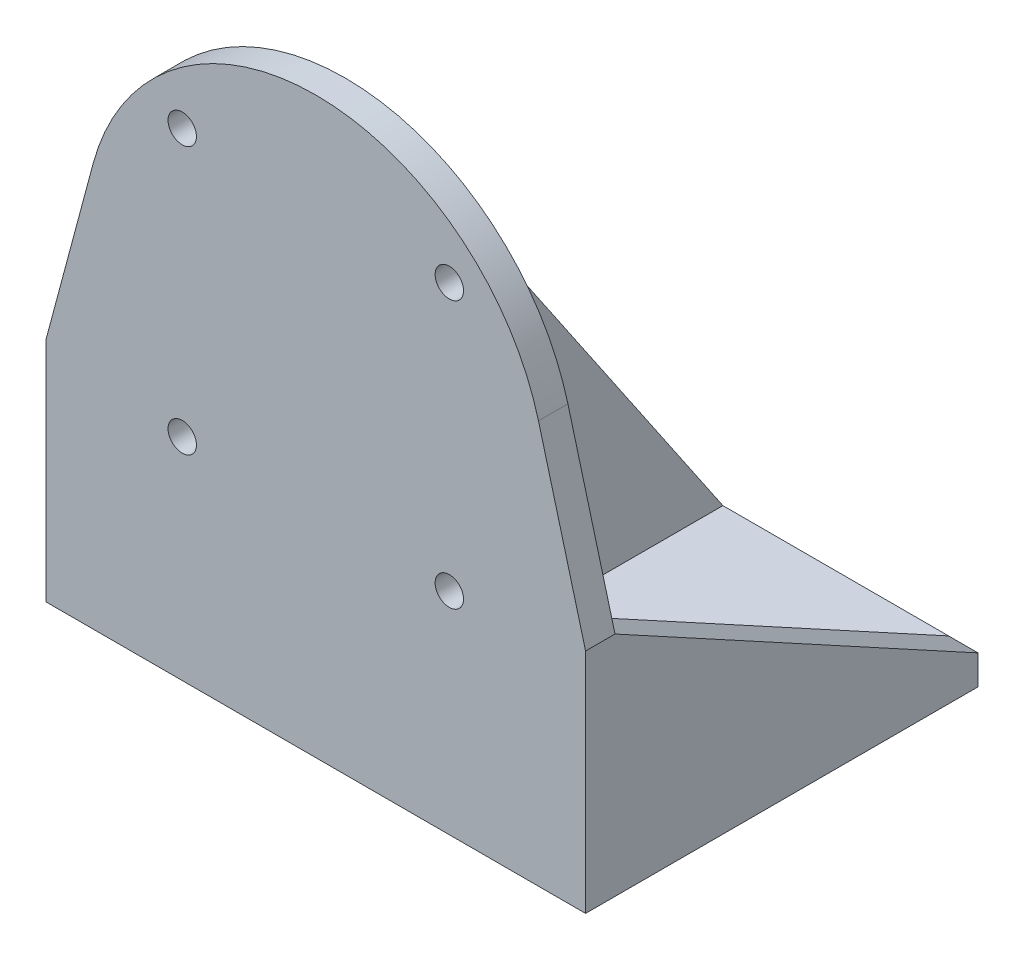
ISO-10303-21;
HEADER;
FILE_DESCRIPTION(('STEP AP214'),'2;1');
FILE_NAME('part.step','',(''),(''),'','','');
FILE_SCHEMA(('AUTOMOTIVE_DESIGN { 1 0 10303 214 1 1 1 1 }'));
ENDSEC;
DATA;
#1=APPLICATION_CONTEXT('core data for automotive mechanical design processes');
#2=APPLICATION_PROTOCOL_DEFINITION('international standard','automotive_design',2000,#1);
#3=PRODUCT_CONTEXT('',#1,'mechanical');
#4=PRODUCT('Part','Part','',(#3));
#5=PRODUCT_RELATED_PRODUCT_CATEGORY('part','',(#4));
#6=PRODUCT_DEFINITION_FORMATION('','',#4);
#7=PRODUCT_DEFINITION_CONTEXT('part definition',#1,'design');
#8=PRODUCT_DEFINITION('design','',#6,#7);
#9=PRODUCT_DEFINITION_SHAPE('','',#8);
#10=(LENGTH_UNIT() NAMED_UNIT(*) SI_UNIT(.MILLI.,.METRE.));
#11=(NAMED_UNIT(*) PLANE_ANGLE_UNIT() SI_UNIT($,.RADIAN.));
#12=(NAMED_UNIT(*) SI_UNIT($,.STERADIAN.) SOLID_ANGLE_UNIT());
#13=UNCERTAINTY_MEASURE_WITH_UNIT(LENGTH_MEASURE(1.E-05),#10,'distance_accuracy_value','');
#14=(GEOMETRIC_REPRESENTATION_CONTEXT(3) GLOBAL_UNCERTAINTY_ASSIGNED_CONTEXT((#13)) GLOBAL_UNIT_ASSIGNED_CONTEXT((#10,
#11,#12)) REPRESENTATION_CONTEXT('',''));
#15=CARTESIAN_POINT('',(0.,0.,0.));
#16=DIRECTION('',(0.,0.,1.));
#17=DIRECTION('',(1.,0.,0.));
#18=AXIS2_PLACEMENT_3D('',#15,#16,#17);
#19=CARTESIAN_POINT('',(13.612,-13.7439864135799,-3.));
#20=DIRECTION('',(0.,0.,-1.));
#21=DIRECTION('',(-1.,0.,0.));
#22=AXIS2_PLACEMENT_3D('',#19,#20,#21);
#23=PLANE('',#22);
#24=CARTESIAN_POINT('',(27.224,-27.224,-3.));
#25=DIRECTION('',(0.,0.,1.));
#26=DIRECTION('',(1.,0.,0.));
#27=AXIS2_PLACEMENT_3D('',#24,#25,#26);
#28=CIRCLE('',#27,1.447765);
#29=CARTESIAN_POINT('',(28.671765,-27.224,-3.));
#30=VERTEX_POINT('',#29);
#31=EDGE_CURVE('E216',#30,#30,#28,.T.);
#32=ORIENTED_EDGE('',*,*,#31,.T.);
#33=EDGE_LOOP('',(#32));
#34=FACE_BOUND('',#33,.T.);
#35=CARTESIAN_POINT('',(0.,-27.224,-3.));
#36=DIRECTION('',(0.,0.,1.));
#37=DIRECTION('',(1.,0.,0.));
#38=AXIS2_PLACEMENT_3D('',#35,#36,#37);
#39=CIRCLE('',#38,1.447765);
#40=CARTESIAN_POINT('',(1.447765,-27.224,-3.));
#41=VERTEX_POINT('',#40);
#42=EDGE_CURVE('E223',#41,#41,#39,.T.);
#43=ORIENTED_EDGE('',*,*,#42,.T.);
#44=EDGE_LOOP('',(#43));
#45=FACE_BOUND('',#44,.T.);
#46=CARTESIAN_POINT('',(27.224,0.,-3.));
#47=DIRECTION('',(0.,0.,1.));
#48=DIRECTION('',(1.,0.,0.));
#49=AXIS2_PLACEMENT_3D('',#46,#47,#48);
#50=CIRCLE('',#49,1.447765);
#51=CARTESIAN_POINT('',(28.671765,0.,-3.));
#52=VERTEX_POINT('',#51);
#53=EDGE_CURVE('E229',#52,#52,#50,.T.);
#54=ORIENTED_EDGE('',*,*,#53,.T.);
#55=EDGE_LOOP('',(#54));
#56=FACE_BOUND('',#55,.T.);
#57=CARTESIAN_POINT('',(0.,0.,-3.));
#58=DIRECTION('',(0.,0.,1.));
#59=DIRECTION('',(1.,0.,0.));
#60=AXIS2_PLACEMENT_3D('',#57,#58,#59);
#61=CIRCLE('',#60,1.447765);
#62=CARTESIAN_POINT('',(1.447765,0.,-3.));
#63=VERTEX_POINT('',#62);
#64=EDGE_CURVE('E235',#63,#63,#61,.T.);
#65=ORIENTED_EDGE('',*,*,#64,.T.);
#66=EDGE_LOOP('',(#65));
#67=FACE_BOUND('',#66,.T.);
#68=DIRECTION('',(0.,-1.,0.));
#69=VECTOR('',#68,1.);
#70=CARTESIAN_POINT('',(-10.8879982105435,-25.5783456611067,-3.));
#71=LINE('',#70,#69);
#72=CARTESIAN_POINT('',(-10.8879982105435,-25.5783456611067,-3.));
#73=VERTEX_POINT('',#72);
#74=CARTESIAN_POINT('',(-10.8879982105435,-45.7439892722092,-3.));
#75=VERTEX_POINT('',#74);
#76=EDGE_CURVE('E184',#73,#75,#71,.T.);
#77=ORIENTED_EDGE('',*,*,#76,.F.);
#78=DIRECTION('',(-1.,0.,0.));
#79=VECTOR('',#78,1.);
#80=CARTESIAN_POINT('',(-10.8879982105435,-25.5783456611067,-3.));
#81=LINE('',#80,#79);
#82=CARTESIAN_POINT('',(-13.8879982105435,-25.5783456611067,-3.));
#83=VERTEX_POINT('',#82);
#84=EDGE_CURVE('E290',#73,#83,#81,.T.);
#85=ORIENTED_EDGE('',*,*,#84,.T.);
#86=DIRECTION('',(-0.258819045102518,-0.965925826289069,0.));
#87=VECTOR('',#86,1.);
#88=CARTESIAN_POINT('',(-9.08725691779313,-7.66173885367076,-3.));
#89=LINE('',#88,#87);
#90=CARTESIAN_POINT('',(-9.08725691779313,-7.66173885367076,-3.));
#91=VERTEX_POINT('',#90);
#92=EDGE_CURVE('E244',#91,#83,#89,.T.);
#93=ORIENTED_EDGE('',*,*,#92,.F.);
#94=CARTESIAN_POINT('',(13.612,-13.7439864135799,-3.));
#95=DIRECTION('',(0.,0.,1.));
#96=DIRECTION('',(-1.,0.,0.));
#97=AXIS2_PLACEMENT_3D('',#94,#95,#96);
#98=CIRCLE('',#97,23.5);
#99=CARTESIAN_POINT('',(36.3112569177931,-7.66173885367076,-3.));
#100=VERTEX_POINT('',#99);
#101=EDGE_CURVE('E241',#100,#91,#98,.T.);
#102=ORIENTED_EDGE('',*,*,#101,.F.);
#103=DIRECTION('',(-0.258819045102518,0.965925826289069,0.));
#104=VECTOR('',#103,1.);
#105=CARTESIAN_POINT('',(36.3112569177931,-7.66173885367076,-3.));
#106=LINE('',#105,#104);
#107=CARTESIAN_POINT('',(41.1119982105435,-25.5783456611067,-3.));
#108=VERTEX_POINT('',#107);
#109=EDGE_CURVE('E248',#108,#100,#106,.T.);
#110=ORIENTED_EDGE('',*,*,#109,.F.);
#111=DIRECTION('',(1.,0.,0.));
#112=VECTOR('',#111,1.);
#113=CARTESIAN_POINT('',(38.1119982105435,-25.5783456611067,-3.));
#114=LINE('',#113,#112);
#115=CARTESIAN_POINT('',(38.1119982105435,-25.5783456611067,-3.));
#116=VERTEX_POINT('',#115);
#117=EDGE_CURVE('E323',#116,#108,#114,.T.);
#118=ORIENTED_EDGE('',*,*,#117,.F.);
#119=DIRECTION('',(0.,-1.,0.));
#120=VECTOR('',#119,1.);
#121=CARTESIAN_POINT('',(38.1119982105435,-25.5783456611067,-3.));
#122=LINE('',#121,#120);
#123=CARTESIAN_POINT('',(38.1119982105435,-45.7439892722092,-3.));
#124=VERTEX_POINT('',#123);
#125=EDGE_CURVE('E321',#116,#124,#122,.T.);
#126=ORIENTED_EDGE('',*,*,#125,.T.);
#127=DIRECTION('',(1.,0.,0.));
#128=VECTOR('',#127,1.);
#129=CARTESIAN_POINT('',(41.1119982105435,-45.7439892722092,-3.));
#130=LINE('',#129,#128);
#131=CARTESIAN_POINT('',(15.112,-45.7439892722092,-3.));
#132=VERTEX_POINT('',#131);
#133=EDGE_CURVE('E206',#132,#124,#130,.T.);
#134=ORIENTED_EDGE('',*,*,#133,.F.);
#135=DIRECTION('',(0.,1.,0.));
#136=VECTOR('',#135,1.);
#137=CARTESIAN_POINT('',(15.112,-45.7439892722092,-3.));
#138=LINE('',#137,#136);
#139=CARTESIAN_POINT('',(15.112,8.75601817311227,-3.));
#140=VERTEX_POINT('',#139);
#141=EDGE_CURVE('E409',#132,#140,#138,.T.);
#142=ORIENTED_EDGE('',*,*,#141,.T.);
#143=DIRECTION('',(-1.,0.,0.));
#144=VECTOR('',#143,1.);
#145=CARTESIAN_POINT('',(15.112,8.75601817311227,-3.));
#146=LINE('',#145,#144);
#147=CARTESIAN_POINT('',(12.112,8.75601817311227,-3.));
#148=VERTEX_POINT('',#147);
#149=EDGE_CURVE('E317',#140,#148,#146,.T.);
#150=ORIENTED_EDGE('',*,*,#149,.T.);
#151=DIRECTION('',(0.,1.,0.));
#152=VECTOR('',#151,1.);
#153=CARTESIAN_POINT('',(12.112,-45.7439892722092,-3.));
#154=LINE('',#153,#152);
#155=CARTESIAN_POINT('',(12.112,-45.7439892722092,-3.));
#156=VERTEX_POINT('',#155);
#157=EDGE_CURVE('E204',#156,#148,#154,.T.);
#158=ORIENTED_EDGE('',*,*,#157,.F.);
#159=EDGE_CURVE('E196',#75,#156,#130,.T.);
#160=ORIENTED_EDGE('',*,*,#159,.F.);
#161=EDGE_LOOP('',(#77,#85,#93,#102,#110,#118,#126,#134,#142,#150,#158,#160));
#162=FACE_BOUND('',#161,.T.);
#163=ADVANCED_FACE('F41',(#34,#45,#56,#67,#162),#23,.T.);
#164=CARTESIAN_POINT('',(41.1119982105435,-45.7439892722092,-40.));
#165=DIRECTION('',(0.,-1.,0.));
#166=DIRECTION('',(0.,0.,-1.));
#167=AXIS2_PLACEMENT_3D('',#164,#165,#166);
#168=PLANE('',#167);
#169=DIRECTION('',(0.,0.,1.));
#170=VECTOR('',#169,1.);
#171=CARTESIAN_POINT('',(29.1119982105435,-45.7439892722092,-30.));
#172=LINE('',#171,#170);
#173=CARTESIAN_POINT('',(29.1119982105435,-45.7439892722092,-30.));
#174=VERTEX_POINT('',#173);
#175=CARTESIAN_POINT('',(29.1119982105435,-45.7439892722092,-13.));
#176=VERTEX_POINT('',#175);
#177=EDGE_CURVE('E344',#174,#176,#172,.T.);
#178=ORIENTED_EDGE('',*,*,#177,.F.);
#179=CARTESIAN_POINT('',(30.7119982105435,-45.7439892722092,-30.));
#180=DIRECTION('',(0.,1.,0.));
#181=DIRECTION('',(0.,0.,1.));
#182=AXIS2_PLACEMENT_3D('',#179,#180,#181);
#183=CIRCLE('',#182,1.6);
#184=CARTESIAN_POINT('',(32.3119982105435,-45.7439892722092,-30.));
#185=VERTEX_POINT('',#184);
#186=EDGE_CURVE('E342',#185,#174,#183,.T.);
#187=ORIENTED_EDGE('',*,*,#186,.F.);
#188=DIRECTION('',(0.,0.,-1.));
#189=VECTOR('',#188,1.);
#190=CARTESIAN_POINT('',(32.3119982105435,-45.7439892722092,-13.));
#191=LINE('',#190,#189);
#192=CARTESIAN_POINT('',(32.3119982105435,-45.7439892722092,-13.));
#193=VERTEX_POINT('',#192);
#194=EDGE_CURVE('E332',#193,#185,#191,.T.);
#195=ORIENTED_EDGE('',*,*,#194,.F.);
#196=CARTESIAN_POINT('',(30.7119982105435,-45.7439892722092,-13.));
#197=DIRECTION('',(0.,1.,0.));
#198=DIRECTION('',(0.,0.,-1.));
#199=AXIS2_PLACEMENT_3D('',#196,#197,#198);
#200=CIRCLE('',#199,1.6);
#201=EDGE_CURVE('E348',#176,#193,#200,.T.);
#202=ORIENTED_EDGE('',*,*,#201,.F.);
#203=EDGE_LOOP('',(#178,#187,#195,#202));
#204=FACE_BOUND('',#203,.T.);
#205=DIRECTION('',(0.,0.,1.));
#206=VECTOR('',#205,1.);
#207=CARTESIAN_POINT('',(15.112,-45.7439892722092,-40.));
#208=LINE('',#207,#206);
#209=CARTESIAN_POINT('',(15.112,-45.7439892722092,-40.));
#210=VERTEX_POINT('',#209);
#211=EDGE_CURVE('E406',#210,#132,#208,.T.);
#212=ORIENTED_EDGE('',*,*,#211,.T.);
#213=ORIENTED_EDGE('',*,*,#133,.T.);
#214=DIRECTION('',(0.,0.,-1.));
#215=VECTOR('',#214,1.);
#216=CARTESIAN_POINT('',(38.1119982105435,-45.7439892722092,-3.));
#217=LINE('',#216,#215);
#218=CARTESIAN_POINT('',(38.1119982105435,-45.7439892722092,-40.));
#219=VERTEX_POINT('',#218);
#220=EDGE_CURVE('E311',#124,#219,#217,.T.);
#221=ORIENTED_EDGE('',*,*,#220,.T.);
#222=DIRECTION('',(1.,0.,0.));
#223=VECTOR('',#222,1.);
#224=CARTESIAN_POINT('',(41.1119982105435,-45.7439892722092,-40.));
#225=LINE('',#224,#223);
#226=EDGE_CURVE('E392',#210,#219,#225,.T.);
#227=ORIENTED_EDGE('',*,*,#226,.F.);
#228=EDGE_LOOP('',(#212,#213,#221,#227));
#229=FACE_BOUND('',#228,.T.);
#230=ADVANCED_FACE('F421',(#204,#229),#168,.F.);
#231=CARTESIAN_POINT('',(13.612,-13.7439864135799,-3.));
#232=DIRECTION('',(0.,0.,1.));
#233=DIRECTION('',(1.,0.,0.));
#234=AXIS2_PLACEMENT_3D('',#231,#232,#233);
#235=CYLINDRICAL_SURFACE('',#234,23.5);
#236=CARTESIAN_POINT('',(13.612,-13.7439864135799,0.));
#237=DIRECTION('',(0.,0.,1.));
#238=DIRECTION('',(-1.,0.,0.));
#239=AXIS2_PLACEMENT_3D('',#236,#237,#238);
#240=CIRCLE('',#239,23.5);
#241=CARTESIAN_POINT('',(36.3112569177931,-7.66173885367076,0.));
#242=VERTEX_POINT('',#241);
#243=CARTESIAN_POINT('',(-9.08725691779313,-7.66173885367076,0.));
#244=VERTEX_POINT('',#243);
#245=EDGE_CURVE('E238',#242,#244,#240,.T.);
#246=ORIENTED_EDGE('',*,*,#245,.F.);
#247=DIRECTION('',(0.,0.,1.));
#248=VECTOR('',#247,1.);
#249=CARTESIAN_POINT('',(36.3112569177931,-7.66173885367076,-3.));
#250=LINE('',#249,#248);
#251=EDGE_CURVE('E11',#100,#242,#250,.T.);
#252=ORIENTED_EDGE('',*,*,#251,.F.);
#253=ORIENTED_EDGE('',*,*,#101,.T.);
#254=DIRECTION('',(0.,0.,1.));
#255=VECTOR('',#254,1.);
#256=CARTESIAN_POINT('',(-9.08725691779313,-7.66173885367076,-3.));
#257=LINE('',#256,#255);
#258=EDGE_CURVE('E45',#91,#244,#257,.T.);
#259=ORIENTED_EDGE('',*,*,#258,.T.);
#260=EDGE_LOOP('',(#246,#252,#253,#259));
#261=FACE_BOUND('',#260,.T.);
#262=ADVANCED_FACE('F43',(#261),#235,.T.);
#263=CARTESIAN_POINT('',(36.3112569177931,-7.66173885367076,-3.));
#264=DIRECTION('',(0.965925826289069,0.258819045102518,0.));
#265=DIRECTION('',(-0.258819045102518,0.965925826289069,0.));
#266=AXIS2_PLACEMENT_3D('',#263,#264,#265);
#267=PLANE('',#266);
#268=DIRECTION('',(-0.258819045102518,0.965925826289069,0.));
#269=VECTOR('',#268,1.);
#270=CARTESIAN_POINT('',(36.3112569177931,-7.66173885367076,0.));
#271=LINE('',#270,#269);
#272=CARTESIAN_POINT('',(41.1119982105435,-25.5783492722092,0.));
#273=VERTEX_POINT('',#272);
#274=EDGE_CURVE('E245',#273,#242,#271,.T.);
#275=ORIENTED_EDGE('',*,*,#274,.F.);
#276=DIRECTION('',(0.,0.,1.));
#277=VECTOR('',#276,1.);
#278=CARTESIAN_POINT('',(41.1119982105435,-25.5783492722092,-3.));
#279=LINE('',#278,#277);
#280=EDGE_CURVE('E50',#108,#273,#279,.T.);
#281=ORIENTED_EDGE('',*,*,#280,.F.);
#282=ORIENTED_EDGE('',*,*,#109,.T.);
#283=ORIENTED_EDGE('',*,*,#251,.T.);
#284=EDGE_LOOP('',(#275,#281,#282,#283));
#285=FACE_BOUND('',#284,.T.);
#286=ADVANCED_FACE('F287',(#285),#267,.T.);
#287=CARTESIAN_POINT('',(41.1119982105435,-25.5783492722092,-3.));
#288=DIRECTION('',(1.,0.,0.));
#289=DIRECTION('',(0.,1.,0.));
#290=AXIS2_PLACEMENT_3D('',#287,#288,#289);
#291=PLANE('',#290);
#292=DIRECTION('',(0.,0.478556275403788,0.878056883847313));
#293=VECTOR('',#292,1.);
#294=CARTESIAN_POINT('',(41.1119982105435,-45.7439892722092,-40.));
#295=LINE('',#294,#293);
#296=CARTESIAN_POINT('',(41.1119982105435,-45.7439892722092,-40.));
#297=VERTEX_POINT('',#296);
#298=EDGE_CURVE('E307',#297,#108,#295,.T.);
#299=ORIENTED_EDGE('',*,*,#298,.T.);
#300=ORIENTED_EDGE('',*,*,#280,.T.);
#301=DIRECTION('',(0.,1.,0.));
#302=VECTOR('',#301,1.);
#303=CARTESIAN_POINT('',(41.1119982105435,-25.5783492722092,0.));
#304=LINE('',#303,#302);
#305=CARTESIAN_POINT('',(41.1119982105435,-48.7439892722092,0.));
#306=VERTEX_POINT('',#305);
#307=EDGE_CURVE('E262',#306,#273,#304,.T.);
#308=ORIENTED_EDGE('',*,*,#307,.F.);
#309=DIRECTION('',(0.,0.,1.));
#310=VECTOR('',#309,1.);
#311=CARTESIAN_POINT('',(41.1119982105435,-48.7439892722092,-3.));
#312=LINE('',#311,#310);
#313=CARTESIAN_POINT('',(41.1119982105435,-48.7439892722092,-40.));
#314=VERTEX_POINT('',#313);
#315=EDGE_CURVE('E268',#314,#306,#312,.T.);
#316=ORIENTED_EDGE('',*,*,#315,.F.);
#317=DIRECTION('',(0.,-1.,0.));
#318=VECTOR('',#317,1.);
#319=CARTESIAN_POINT('',(41.1119982105435,-45.7439892722092,-40.));
#320=LINE('',#319,#318);
#321=EDGE_CURVE('E205',#297,#314,#320,.T.);
#322=ORIENTED_EDGE('',*,*,#321,.F.);
#323=EDGE_LOOP('',(#299,#300,#308,#316,#322));
#324=FACE_BOUND('',#323,.T.);
#325=ADVANCED_FACE('F306',(#324),#291,.T.);
#326=CARTESIAN_POINT('',(-13.8879982105435,-48.7439892722092,-3.));
#327=DIRECTION('',(0.,-1.,0.));
#328=DIRECTION('',(0.,0.,-1.));
#329=AXIS2_PLACEMENT_3D('',#326,#327,#328);
#330=PLANE('',#329);
#331=CARTESIAN_POINT('',(30.7119982105435,-48.7439892722092,-30.));
#332=DIRECTION('',(0.,1.,0.));
#333=DIRECTION('',(0.,0.,1.));
#334=AXIS2_PLACEMENT_3D('',#331,#332,#333);
#335=CIRCLE('',#334,1.6);
#336=CARTESIAN_POINT('',(32.3119982105435,-48.7439892722092,-30.));
#337=VERTEX_POINT('',#336);
#338=CARTESIAN_POINT('',(29.1119982105435,-48.7439892722092,-30.));
#339=VERTEX_POINT('',#338);
#340=EDGE_CURVE('E328',#337,#339,#335,.T.);
#341=ORIENTED_EDGE('',*,*,#340,.T.);
#342=DIRECTION('',(0.,0.,1.));
#343=VECTOR('',#342,1.);
#344=CARTESIAN_POINT('',(29.1119982105435,-48.7439892722092,-30.));
#345=LINE('',#344,#343);
#346=CARTESIAN_POINT('',(29.1119982105435,-48.7439892722092,-13.));
#347=VERTEX_POINT('',#346);
#348=EDGE_CURVE('E331',#339,#347,#345,.T.);
#349=ORIENTED_EDGE('',*,*,#348,.T.);
#350=CARTESIAN_POINT('',(30.7119982105435,-48.7439892722092,-13.));
#351=DIRECTION('',(0.,1.,0.));
#352=DIRECTION('',(0.,0.,-1.));
#353=AXIS2_PLACEMENT_3D('',#350,#351,#352);
#354=CIRCLE('',#353,1.6);
#355=CARTESIAN_POINT('',(32.3119982105435,-48.7439892722092,-13.));
#356=VERTEX_POINT('',#355);
#357=EDGE_CURVE('E335',#347,#356,#354,.T.);
#358=ORIENTED_EDGE('',*,*,#357,.T.);
#359=DIRECTION('',(0.,0.,-1.));
#360=VECTOR('',#359,1.);
#361=CARTESIAN_POINT('',(32.3119982105435,-48.7439892722092,-13.));
#362=LINE('',#361,#360);
#363=EDGE_CURVE('E338',#356,#337,#362,.T.);
#364=ORIENTED_EDGE('',*,*,#363,.T.);
#365=EDGE_LOOP('',(#341,#349,#358,#364));
#366=FACE_BOUND('',#365,.T.);
#367=CARTESIAN_POINT('',(-3.48799821054348,-48.7439892722092,-13.));
#368=DIRECTION('',(0.,1.,0.));
#369=DIRECTION('',(0.,0.,1.));
#370=AXIS2_PLACEMENT_3D('',#367,#368,#369);
#371=CIRCLE('',#370,1.59999999999999);
#372=CARTESIAN_POINT('',(-5.08799821054347,-48.7439892722092,-13.));
#373=VERTEX_POINT('',#372);
#374=CARTESIAN_POINT('',(-1.88799821054349,-48.7439892722092,-13.));
#375=VERTEX_POINT('',#374);
#376=EDGE_CURVE('E373',#373,#375,#371,.T.);
#377=ORIENTED_EDGE('',*,*,#376,.T.);
#378=DIRECTION('',(0.,0.,-1.));
#379=VECTOR('',#378,1.);
#380=CARTESIAN_POINT('',(-1.88799821054349,-48.7439892722092,-30.));
#381=LINE('',#380,#379);
#382=CARTESIAN_POINT('',(-1.88799821054349,-48.7439892722092,-30.));
#383=VERTEX_POINT('',#382);
#384=EDGE_CURVE('E385',#375,#383,#381,.T.);
#385=ORIENTED_EDGE('',*,*,#384,.T.);
#386=CARTESIAN_POINT('',(-3.48799821054349,-48.7439892722092,-30.));
#387=DIRECTION('',(0.,1.,0.));
#388=DIRECTION('',(0.,0.,-1.));
#389=AXIS2_PLACEMENT_3D('',#386,#387,#388);
#390=CIRCLE('',#389,1.59999999999999);
#391=CARTESIAN_POINT('',(-5.08799821054347,-48.7439892722092,-30.));
#392=VERTEX_POINT('',#391);
#393=EDGE_CURVE('E382',#383,#392,#390,.T.);
#394=ORIENTED_EDGE('',*,*,#393,.T.);
#395=DIRECTION('',(0.,0.,1.));
#396=VECTOR('',#395,1.);
#397=CARTESIAN_POINT('',(-5.08799821054347,-48.7439892722092,-13.));
#398=LINE('',#397,#396);
#399=EDGE_CURVE('E363',#392,#373,#398,.T.);
#400=ORIENTED_EDGE('',*,*,#399,.T.);
#401=EDGE_LOOP('',(#377,#385,#394,#400));
#402=FACE_BOUND('',#401,.T.);
#403=DIRECTION('',(1.,0.,0.));
#404=VECTOR('',#403,1.);
#405=CARTESIAN_POINT('',(-13.8879982105435,-48.7439892722092,0.));
#406=LINE('',#405,#404);
#407=CARTESIAN_POINT('',(-13.8879982105435,-48.7439892722092,0.));
#408=VERTEX_POINT('',#407);
#409=EDGE_CURVE('E259',#408,#306,#406,.T.);
#410=ORIENTED_EDGE('',*,*,#409,.F.);
#411=DIRECTION('',(0.,0.,1.));
#412=VECTOR('',#411,1.);
#413=CARTESIAN_POINT('',(-13.8879982105435,-48.7439892722092,-3.));
#414=LINE('',#413,#412);
#415=CARTESIAN_POINT('',(-13.8879982105435,-48.7439892722092,-40.));
#416=VERTEX_POINT('',#415);
#417=EDGE_CURVE('E270',#416,#408,#414,.T.);
#418=ORIENTED_EDGE('',*,*,#417,.F.);
#419=DIRECTION('',(-1.,0.,0.));
#420=VECTOR('',#419,1.);
#421=CARTESIAN_POINT('',(41.1119982105435,-48.7439892722092,-40.));
#422=LINE('',#421,#420);
#423=EDGE_CURVE('E209',#314,#416,#422,.T.);
#424=ORIENTED_EDGE('',*,*,#423,.F.);
#425=ORIENTED_EDGE('',*,*,#315,.T.);
#426=EDGE_LOOP('',(#410,#418,#424,#425));
#427=FACE_BOUND('',#426,.T.);
#428=ADVANCED_FACE('F300',(#366,#402,#427),#330,.T.);
#429=CARTESIAN_POINT('',(-13.8879982105435,-25.5783492722092,-3.));
#430=DIRECTION('',(-1.,0.,0.));
#431=DIRECTION('',(0.,-1.,0.));
#432=AXIS2_PLACEMENT_3D('',#429,#430,#431);
#433=PLANE('',#432);
#434=DIRECTION('',(0.,-1.,0.));
#435=VECTOR('',#434,1.);
#436=CARTESIAN_POINT('',(-13.8879982105435,-25.5783492722092,0.));
#437=LINE('',#436,#435);
#438=CARTESIAN_POINT('',(-13.8879982105435,-25.5783492722092,0.));
#439=VERTEX_POINT('',#438);
#440=EDGE_CURVE('E256',#439,#408,#437,.T.);
#441=ORIENTED_EDGE('',*,*,#440,.F.);
#442=DIRECTION('',(0.,0.,1.));
#443=VECTOR('',#442,1.);
#444=CARTESIAN_POINT('',(-13.8879982105435,-25.5783492722092,-3.));
#445=LINE('',#444,#443);
#446=EDGE_CURVE('E271',#83,#439,#445,.T.);
#447=ORIENTED_EDGE('',*,*,#446,.F.);
#448=DIRECTION('',(0.,0.478556275403788,0.878056883847313));
#449=VECTOR('',#448,1.);
#450=CARTESIAN_POINT('',(-13.8879982105435,-45.7439892722092,-40.));
#451=LINE('',#450,#449);
#452=CARTESIAN_POINT('',(-13.8879982105435,-45.7439892722092,-40.));
#453=VERTEX_POINT('',#452);
#454=EDGE_CURVE('E200',#453,#83,#451,.T.);
#455=ORIENTED_EDGE('',*,*,#454,.F.);
#456=DIRECTION('',(0.,1.,0.));
#457=VECTOR('',#456,1.);
#458=CARTESIAN_POINT('',(-13.8879982105435,-48.7439892722092,-40.));
#459=LINE('',#458,#457);
#460=EDGE_CURVE('E390',#416,#453,#459,.T.);
#461=ORIENTED_EDGE('',*,*,#460,.F.);
#462=ORIENTED_EDGE('',*,*,#417,.T.);
#463=EDGE_LOOP('',(#441,#447,#455,#461,#462));
#464=FACE_BOUND('',#463,.T.);
#465=ADVANCED_FACE('F295',(#464),#433,.T.);
#466=CARTESIAN_POINT('',(-9.08725691779313,-7.66173885367076,-3.));
#467=DIRECTION('',(-0.965925826289069,0.258819045102518,0.));
#468=DIRECTION('',(-0.258819045102518,-0.965925826289069,0.));
#469=AXIS2_PLACEMENT_3D('',#466,#467,#468);
#470=PLANE('',#469);
#471=DIRECTION('',(-0.258819045102518,-0.965925826289069,0.));
#472=VECTOR('',#471,1.);
#473=CARTESIAN_POINT('',(-9.08725691779313,-7.66173885367076,0.));
#474=LINE('',#473,#472);
#475=EDGE_CURVE('E253',#244,#439,#474,.T.);
#476=ORIENTED_EDGE('',*,*,#475,.F.);
#477=ORIENTED_EDGE('',*,*,#258,.F.);
#478=ORIENTED_EDGE('',*,*,#92,.T.);
#479=ORIENTED_EDGE('',*,*,#446,.T.);
#480=EDGE_LOOP('',(#476,#477,#478,#479));
#481=FACE_BOUND('',#480,.T.);
#482=ADVANCED_FACE('F280',(#481),#470,.T.);
#483=CARTESIAN_POINT('',(13.612,-13.7439864135799,0.));
#484=DIRECTION('',(0.,0.,-1.));
#485=DIRECTION('',(-1.,0.,0.));
#486=AXIS2_PLACEMENT_3D('',#483,#484,#485);
#487=PLANE('',#486);
#488=CARTESIAN_POINT('',(27.224,-27.224,0.));
#489=DIRECTION('',(0.,0.,1.));
#490=DIRECTION('',(1.,0.,0.));
#491=AXIS2_PLACEMENT_3D('',#488,#489,#490);
#492=CIRCLE('',#491,1.447765);
#493=CARTESIAN_POINT('',(28.671765,-27.224,0.));
#494=VERTEX_POINT('',#493);
#495=EDGE_CURVE('E220',#494,#494,#492,.T.);
#496=ORIENTED_EDGE('',*,*,#495,.F.);
#497=EDGE_LOOP('',(#496));
#498=FACE_BOUND('',#497,.T.);
#499=CARTESIAN_POINT('',(0.,-27.224,0.));
#500=DIRECTION('',(0.,0.,1.));
#501=DIRECTION('',(1.,0.,0.));
#502=AXIS2_PLACEMENT_3D('',#499,#500,#501);
#503=CIRCLE('',#502,1.447765);
#504=CARTESIAN_POINT('',(1.447765,-27.224,0.));
#505=VERTEX_POINT('',#504);
#506=EDGE_CURVE('E219',#505,#505,#503,.T.);
#507=ORIENTED_EDGE('',*,*,#506,.F.);
#508=EDGE_LOOP('',(#507));
#509=FACE_BOUND('',#508,.T.);
#510=CARTESIAN_POINT('',(27.224,0.,0.));
#511=DIRECTION('',(0.,0.,1.));
#512=DIRECTION('',(1.,0.,0.));
#513=AXIS2_PLACEMENT_3D('',#510,#511,#512);
#514=CIRCLE('',#513,1.447765);
#515=CARTESIAN_POINT('',(28.671765,0.,0.));
#516=VERTEX_POINT('',#515);
#517=EDGE_CURVE('E226',#516,#516,#514,.T.);
#518=ORIENTED_EDGE('',*,*,#517,.F.);
#519=EDGE_LOOP('',(#518));
#520=FACE_BOUND('',#519,.T.);
#521=CARTESIAN_POINT('',(0.,0.,0.));
#522=DIRECTION('',(0.,0.,1.));
#523=DIRECTION('',(1.,0.,0.));
#524=AXIS2_PLACEMENT_3D('',#521,#522,#523);
#525=CIRCLE('',#524,1.447765);
#526=CARTESIAN_POINT('',(1.447765,0.,0.));
#527=VERTEX_POINT('',#526);
#528=EDGE_CURVE('E232',#527,#527,#525,.T.);
#529=ORIENTED_EDGE('',*,*,#528,.F.);
#530=EDGE_LOOP('',(#529));
#531=FACE_BOUND('',#530,.T.);
#532=ORIENTED_EDGE('',*,*,#245,.T.);
#533=ORIENTED_EDGE('',*,*,#475,.T.);
#534=ORIENTED_EDGE('',*,*,#440,.T.);
#535=ORIENTED_EDGE('',*,*,#409,.T.);
#536=ORIENTED_EDGE('',*,*,#307,.T.);
#537=ORIENTED_EDGE('',*,*,#274,.T.);
#538=EDGE_LOOP('',(#532,#533,#534,#535,#536,#537));
#539=FACE_BOUND('',#538,.T.);
#540=ADVANCED_FACE('F282',(#498,#509,#520,#531,#539),#487,.F.);
#541=CARTESIAN_POINT('',(0.,0.,-3.));
#542=DIRECTION('',(0.,0.,1.));
#543=DIRECTION('',(1.,0.,0.));
#544=AXIS2_PLACEMENT_3D('',#541,#542,#543);
#545=CYLINDRICAL_SURFACE('',#544,1.447765);
#546=ORIENTED_EDGE('',*,*,#64,.F.);
#547=EDGE_LOOP('',(#546));
#548=FACE_BOUND('',#547,.T.);
#549=ORIENTED_EDGE('',*,*,#528,.T.);
#550=EDGE_LOOP('',(#549));
#551=FACE_BOUND('',#550,.T.);
#552=ADVANCED_FACE('F448',(#548,#551),#545,.F.);
#553=CARTESIAN_POINT('',(27.224,0.,-3.));
#554=DIRECTION('',(0.,0.,1.));
#555=DIRECTION('',(1.,0.,0.));
#556=AXIS2_PLACEMENT_3D('',#553,#554,#555);
#557=CYLINDRICAL_SURFACE('',#556,1.447765);
#558=ORIENTED_EDGE('',*,*,#53,.F.);
#559=EDGE_LOOP('',(#558));
#560=FACE_BOUND('',#559,.T.);
#561=ORIENTED_EDGE('',*,*,#517,.T.);
#562=EDGE_LOOP('',(#561));
#563=FACE_BOUND('',#562,.T.);
#564=ADVANCED_FACE('F630',(#560,#563),#557,.F.);
#565=CARTESIAN_POINT('',(0.,-27.224,-3.));
#566=DIRECTION('',(0.,0.,1.));
#567=DIRECTION('',(1.,0.,0.));
#568=AXIS2_PLACEMENT_3D('',#565,#566,#567);
#569=CYLINDRICAL_SURFACE('',#568,1.447765);
#570=ORIENTED_EDGE('',*,*,#42,.F.);
#571=EDGE_LOOP('',(#570));
#572=FACE_BOUND('',#571,.T.);
#573=ORIENTED_EDGE('',*,*,#506,.T.);
#574=EDGE_LOOP('',(#573));
#575=FACE_BOUND('',#574,.T.);
#576=ADVANCED_FACE('F620',(#572,#575),#569,.F.);
#577=CARTESIAN_POINT('',(27.224,-27.224,-3.));
#578=DIRECTION('',(0.,0.,1.));
#579=DIRECTION('',(1.,0.,0.));
#580=AXIS2_PLACEMENT_3D('',#577,#578,#579);
#581=CYLINDRICAL_SURFACE('',#580,1.447765);
#582=ORIENTED_EDGE('',*,*,#31,.F.);
#583=EDGE_LOOP('',(#582));
#584=FACE_BOUND('',#583,.T.);
#585=ORIENTED_EDGE('',*,*,#495,.T.);
#586=EDGE_LOOP('',(#585));
#587=FACE_BOUND('',#586,.T.);
#588=ADVANCED_FACE('F474',(#584,#587),#581,.F.);
#589=DIRECTION('',(0.,0.,-1.));
#590=VECTOR('',#589,1.);
#591=CARTESIAN_POINT('',(-1.88799821054349,-45.7439892722092,-30.));
#592=LINE('',#591,#590);
#593=CARTESIAN_POINT('',(-1.88799821054349,-45.7439892722092,-13.));
#594=VERTEX_POINT('',#593);
#595=CARTESIAN_POINT('',(-1.88799821054349,-45.7439892722092,-30.));
#596=VERTEX_POINT('',#595);
#597=EDGE_CURVE('E376',#594,#596,#592,.T.);
#598=ORIENTED_EDGE('',*,*,#597,.F.);
#599=CARTESIAN_POINT('',(-3.48799821054348,-45.7439892722092,-13.));
#600=DIRECTION('',(0.,1.,0.));
#601=DIRECTION('',(0.,0.,1.));
#602=AXIS2_PLACEMENT_3D('',#599,#600,#601);
#603=CIRCLE('',#602,1.59999999999999);
#604=CARTESIAN_POINT('',(-5.08799821054347,-45.7439892722092,-13.));
#605=VERTEX_POINT('',#604);
#606=EDGE_CURVE('E345',#605,#594,#603,.T.);
#607=ORIENTED_EDGE('',*,*,#606,.F.);
#608=DIRECTION('',(0.,0.,1.));
#609=VECTOR('',#608,1.);
#610=CARTESIAN_POINT('',(-5.08799821054347,-45.7439892722092,-13.));
#611=LINE('',#610,#609);
#612=CARTESIAN_POINT('',(-5.08799821054347,-45.7439892722092,-30.));
#613=VERTEX_POINT('',#612);
#614=EDGE_CURVE('E369',#613,#605,#611,.T.);
#615=ORIENTED_EDGE('',*,*,#614,.F.);
#616=CARTESIAN_POINT('',(-3.48799821054349,-45.7439892722092,-30.));
#617=DIRECTION('',(0.,1.,0.));
#618=DIRECTION('',(0.,0.,-1.));
#619=AXIS2_PLACEMENT_3D('',#616,#617,#618);
#620=CIRCLE('',#619,1.59999999999999);
#621=EDGE_CURVE('E372',#596,#613,#620,.T.);
#622=ORIENTED_EDGE('',*,*,#621,.F.);
#623=EDGE_LOOP('',(#598,#607,#615,#622));
#624=FACE_BOUND('',#623,.T.);
#625=CARTESIAN_POINT('',(-10.8879982105435,-45.7439892722092,-40.));
#626=VERTEX_POINT('',#625);
#627=CARTESIAN_POINT('',(12.112,-45.7439892722092,-40.));
#628=VERTEX_POINT('',#627);
#629=EDGE_CURVE('E198',#626,#628,#225,.T.);
#630=ORIENTED_EDGE('',*,*,#629,.F.);
#631=DIRECTION('',(0.,0.,-1.));
#632=VECTOR('',#631,1.);
#633=CARTESIAN_POINT('',(-10.8879982105435,-45.7439892722092,-3.));
#634=LINE('',#633,#632);
#635=EDGE_CURVE('E58',#75,#626,#634,.T.);
#636=ORIENTED_EDGE('',*,*,#635,.F.);
#637=ORIENTED_EDGE('',*,*,#159,.T.);
#638=DIRECTION('',(0.,0.,1.));
#639=VECTOR('',#638,1.);
#640=CARTESIAN_POINT('',(12.112,-45.7439892722092,-40.));
#641=LINE('',#640,#639);
#642=EDGE_CURVE('E292',#628,#156,#641,.T.);
#643=ORIENTED_EDGE('',*,*,#642,.F.);
#644=EDGE_LOOP('',(#630,#636,#637,#643));
#645=FACE_BOUND('',#644,.T.);
#646=ADVANCED_FACE('F194',(#624,#645),#168,.F.);
#647=CARTESIAN_POINT('',(0.,0.,-40.));
#648=DIRECTION('',(0.,0.,-1.));
#649=DIRECTION('',(-1.,0.,0.));
#650=AXIS2_PLACEMENT_3D('',#647,#648,#649);
#651=PLANE('',#650);
#652=ORIENTED_EDGE('',*,*,#321,.T.);
#653=ORIENTED_EDGE('',*,*,#423,.T.);
#654=ORIENTED_EDGE('',*,*,#460,.T.);
#655=EDGE_CURVE('E214',#453,#626,#225,.T.);
#656=ORIENTED_EDGE('',*,*,#655,.T.);
#657=ORIENTED_EDGE('',*,*,#629,.T.);
#658=DIRECTION('',(-1.,0.,0.));
#659=VECTOR('',#658,1.);
#660=CARTESIAN_POINT('',(15.112,-45.7439892722092,-40.));
#661=LINE('',#660,#659);
#662=EDGE_CURVE('E312',#210,#628,#661,.T.);
#663=ORIENTED_EDGE('',*,*,#662,.F.);
#664=ORIENTED_EDGE('',*,*,#226,.T.);
#665=DIRECTION('',(1.,0.,0.));
#666=VECTOR('',#665,1.);
#667=CARTESIAN_POINT('',(38.1119982105435,-45.7439892722092,-40.));
#668=LINE('',#667,#666);
#669=EDGE_CURVE('E326',#219,#297,#668,.T.);
#670=ORIENTED_EDGE('',*,*,#669,.T.);
#671=EDGE_LOOP('',(#652,#653,#654,#656,#657,#663,#664,#670));
#672=FACE_BOUND('',#671,.T.);
#673=ADVANCED_FACE('F396',(#672),#651,.T.);
#674=CARTESIAN_POINT('',(-3.48799821054348,-48.7439892722092,-13.));
#675=DIRECTION('',(0.,1.,0.));
#676=DIRECTION('',(0.,0.,1.));
#677=AXIS2_PLACEMENT_3D('',#674,#675,#676);
#678=CYLINDRICAL_SURFACE('',#677,1.59999999999999);
#679=ORIENTED_EDGE('',*,*,#606,.T.);
#680=DIRECTION('',(0.,1.,0.));
#681=VECTOR('',#680,1.);
#682=CARTESIAN_POINT('',(-1.88799821054349,-48.7439892722092,-13.));
#683=LINE('',#682,#681);
#684=EDGE_CURVE('E360',#375,#594,#683,.T.);
#685=ORIENTED_EDGE('',*,*,#684,.F.);
#686=ORIENTED_EDGE('',*,*,#376,.F.);
#687=DIRECTION('',(0.,1.,0.));
#688=VECTOR('',#687,1.);
#689=CARTESIAN_POINT('',(-5.08799821054347,-48.7439892722092,-13.));
#690=LINE('',#689,#688);
#691=EDGE_CURVE('E325',#373,#605,#690,.T.);
#692=ORIENTED_EDGE('',*,*,#691,.T.);
#693=EDGE_LOOP('',(#679,#685,#686,#692));
#694=FACE_BOUND('',#693,.T.);
#695=ADVANCED_FACE('F482',(#694),#678,.F.);
#696=CARTESIAN_POINT('',(-5.08799821054347,-48.7439892722092,-13.));
#697=DIRECTION('',(-1.,0.,0.));
#698=DIRECTION('',(0.,0.,1.));
#699=AXIS2_PLACEMENT_3D('',#696,#697,#698);
#700=PLANE('',#699);
#701=ORIENTED_EDGE('',*,*,#614,.T.);
#702=ORIENTED_EDGE('',*,*,#691,.F.);
#703=ORIENTED_EDGE('',*,*,#399,.F.);
#704=DIRECTION('',(0.,1.,0.));
#705=VECTOR('',#704,1.);
#706=CARTESIAN_POINT('',(-5.08799821054347,-48.7439892722092,-30.));
#707=LINE('',#706,#705);
#708=EDGE_CURVE('E366',#392,#613,#707,.T.);
#709=ORIENTED_EDGE('',*,*,#708,.T.);
#710=EDGE_LOOP('',(#701,#702,#703,#709));
#711=FACE_BOUND('',#710,.T.);
#712=ADVANCED_FACE('F594',(#711),#700,.F.);
#713=CARTESIAN_POINT('',(-3.48799821054349,-48.7439892722092,-30.));
#714=DIRECTION('',(0.,1.,0.));
#715=DIRECTION('',(0.,0.,1.));
#716=AXIS2_PLACEMENT_3D('',#713,#714,#715);
#717=CYLINDRICAL_SURFACE('',#716,1.59999999999999);
#718=ORIENTED_EDGE('',*,*,#621,.T.);
#719=ORIENTED_EDGE('',*,*,#708,.F.);
#720=ORIENTED_EDGE('',*,*,#393,.F.);
#721=DIRECTION('',(0.,1.,0.));
#722=VECTOR('',#721,1.);
#723=CARTESIAN_POINT('',(-1.88799821054349,-48.7439892722092,-30.));
#724=LINE('',#723,#722);
#725=EDGE_CURVE('E364',#383,#596,#724,.T.);
#726=ORIENTED_EDGE('',*,*,#725,.T.);
#727=EDGE_LOOP('',(#718,#719,#720,#726));
#728=FACE_BOUND('',#727,.T.);
#729=ADVANCED_FACE('F585',(#728),#717,.F.);
#730=CARTESIAN_POINT('',(-1.88799821054349,-48.7439892722092,-30.));
#731=DIRECTION('',(1.,0.,0.));
#732=DIRECTION('',(0.,0.,-1.));
#733=AXIS2_PLACEMENT_3D('',#730,#731,#732);
#734=PLANE('',#733);
#735=ORIENTED_EDGE('',*,*,#597,.T.);
#736=ORIENTED_EDGE('',*,*,#725,.F.);
#737=ORIENTED_EDGE('',*,*,#384,.F.);
#738=ORIENTED_EDGE('',*,*,#684,.T.);
#739=EDGE_LOOP('',(#735,#736,#737,#738));
#740=FACE_BOUND('',#739,.T.);
#741=ADVANCED_FACE('F576',(#740),#734,.F.);
#742=CARTESIAN_POINT('',(30.7119982105435,-48.7439892722092,-30.));
#743=DIRECTION('',(0.,1.,0.));
#744=DIRECTION('',(0.,0.,1.));
#745=AXIS2_PLACEMENT_3D('',#742,#743,#744);
#746=CYLINDRICAL_SURFACE('',#745,1.6);
#747=ORIENTED_EDGE('',*,*,#186,.T.);
#748=DIRECTION('',(0.,1.,0.));
#749=VECTOR('',#748,1.);
#750=CARTESIAN_POINT('',(29.1119982105435,-48.7439892722092,-30.));
#751=LINE('',#750,#749);
#752=EDGE_CURVE('E341',#339,#174,#751,.T.);
#753=ORIENTED_EDGE('',*,*,#752,.F.);
#754=ORIENTED_EDGE('',*,*,#340,.F.);
#755=DIRECTION('',(0.,1.,0.));
#756=VECTOR('',#755,1.);
#757=CARTESIAN_POINT('',(32.3119982105435,-48.7439892722092,-30.));
#758=LINE('',#757,#756);
#759=EDGE_CURVE('E211',#337,#185,#758,.T.);
#760=ORIENTED_EDGE('',*,*,#759,.T.);
#761=EDGE_LOOP('',(#747,#753,#754,#760));
#762=FACE_BOUND('',#761,.T.);
#763=ADVANCED_FACE('F567',(#762),#746,.F.);
#764=CARTESIAN_POINT('',(32.3119982105435,-48.7439892722092,-13.));
#765=DIRECTION('',(1.,0.,0.));
#766=DIRECTION('',(0.,0.,-1.));
#767=AXIS2_PLACEMENT_3D('',#764,#765,#766);
#768=PLANE('',#767);
#769=ORIENTED_EDGE('',*,*,#194,.T.);
#770=ORIENTED_EDGE('',*,*,#759,.F.);
#771=ORIENTED_EDGE('',*,*,#363,.F.);
#772=DIRECTION('',(0.,1.,0.));
#773=VECTOR('',#772,1.);
#774=CARTESIAN_POINT('',(32.3119982105435,-48.7439892722092,-13.));
#775=LINE('',#774,#773);
#776=EDGE_CURVE('E354',#356,#193,#775,.T.);
#777=ORIENTED_EDGE('',*,*,#776,.T.);
#778=EDGE_LOOP('',(#769,#770,#771,#777));
#779=FACE_BOUND('',#778,.T.);
#780=ADVANCED_FACE('F558',(#779),#768,.F.);
#781=CARTESIAN_POINT('',(30.7119982105435,-48.7439892722092,-13.));
#782=DIRECTION('',(0.,1.,0.));
#783=DIRECTION('',(0.,0.,1.));
#784=AXIS2_PLACEMENT_3D('',#781,#782,#783);
#785=CYLINDRICAL_SURFACE('',#784,1.6);
#786=ORIENTED_EDGE('',*,*,#201,.T.);
#787=ORIENTED_EDGE('',*,*,#776,.F.);
#788=ORIENTED_EDGE('',*,*,#357,.F.);
#789=DIRECTION('',(0.,1.,0.));
#790=VECTOR('',#789,1.);
#791=CARTESIAN_POINT('',(29.1119982105435,-48.7439892722092,-13.));
#792=LINE('',#791,#790);
#793=EDGE_CURVE('E356',#347,#176,#792,.T.);
#794=ORIENTED_EDGE('',*,*,#793,.T.);
#795=EDGE_LOOP('',(#786,#787,#788,#794));
#796=FACE_BOUND('',#795,.T.);
#797=ADVANCED_FACE('F549',(#796),#785,.F.);
#798=CARTESIAN_POINT('',(29.1119982105435,-48.7439892722092,-30.));
#799=DIRECTION('',(-1.,0.,0.));
#800=DIRECTION('',(0.,0.,1.));
#801=AXIS2_PLACEMENT_3D('',#798,#799,#800);
#802=PLANE('',#801);
#803=ORIENTED_EDGE('',*,*,#177,.T.);
#804=ORIENTED_EDGE('',*,*,#793,.F.);
#805=ORIENTED_EDGE('',*,*,#348,.F.);
#806=ORIENTED_EDGE('',*,*,#752,.T.);
#807=EDGE_LOOP('',(#803,#804,#805,#806));
#808=FACE_BOUND('',#807,.T.);
#809=ADVANCED_FACE('F540',(#808),#802,.F.);
#810=CARTESIAN_POINT('',(38.1119982105435,-45.7439892722092,-40.));
#811=DIRECTION('',(0.,0.878056883847313,-0.478556275403788));
#812=DIRECTION('',(0.,0.478556275403788,0.878056883847313));
#813=AXIS2_PLACEMENT_3D('',#810,#811,#812);
#814=PLANE('',#813);
#815=ORIENTED_EDGE('',*,*,#298,.F.);
#816=ORIENTED_EDGE('',*,*,#669,.F.);
#817=DIRECTION('',(0.,0.478556275403788,0.878056883847313));
#818=VECTOR('',#817,1.);
#819=CARTESIAN_POINT('',(38.1119982105435,-45.7439892722092,-40.));
#820=LINE('',#819,#818);
#821=EDGE_CURVE('E315',#219,#116,#820,.T.);
#822=ORIENTED_EDGE('',*,*,#821,.T.);
#823=ORIENTED_EDGE('',*,*,#117,.T.);
#824=EDGE_LOOP('',(#815,#816,#822,#823));
#825=FACE_BOUND('',#824,.T.);
#826=ADVANCED_FACE('F532',(#825),#814,.T.);
#827=CARTESIAN_POINT('',(38.1119982105435,0.,0.));
#828=DIRECTION('',(-1.,0.,0.));
#829=DIRECTION('',(0.,-1.,0.));
#830=AXIS2_PLACEMENT_3D('',#827,#828,#829);
#831=PLANE('',#830);
#832=ORIENTED_EDGE('',*,*,#220,.F.);
#833=ORIENTED_EDGE('',*,*,#125,.F.);
#834=ORIENTED_EDGE('',*,*,#821,.F.);
#835=EDGE_LOOP('',(#832,#833,#834));
#836=FACE_BOUND('',#835,.T.);
#837=ADVANCED_FACE('F419',(#836),#831,.T.);
#838=CARTESIAN_POINT('',(15.112,-45.7439892722092,-40.));
#839=DIRECTION('',(0.,0.561686967602351,-0.827349835574816));
#840=DIRECTION('',(0.,0.827349835574816,0.561686967602351));
#841=AXIS2_PLACEMENT_3D('',#838,#839,#840);
#842=PLANE('',#841);
#843=ORIENTED_EDGE('',*,*,#662,.T.);
#844=DIRECTION('',(0.,-0.827349835574816,-0.561686967602351));
#845=VECTOR('',#844,1.);
#846=CARTESIAN_POINT('',(12.112,-45.7439892722092,-40.));
#847=LINE('',#846,#845);
#848=EDGE_CURVE('E403',#148,#628,#847,.T.);
#849=ORIENTED_EDGE('',*,*,#848,.F.);
#850=ORIENTED_EDGE('',*,*,#149,.F.);
#851=DIRECTION('',(0.,-0.827349835574816,-0.561686967602351));
#852=VECTOR('',#851,1.);
#853=CARTESIAN_POINT('',(15.112,-45.7439892722092,-40.));
#854=LINE('',#853,#852);
#855=EDGE_CURVE('E66',#140,#210,#854,.T.);
#856=ORIENTED_EDGE('',*,*,#855,.T.);
#857=EDGE_LOOP('',(#843,#849,#850,#856));
#858=FACE_BOUND('',#857,.T.);
#859=ADVANCED_FACE('F425',(#858),#842,.T.);
#860=CARTESIAN_POINT('',(15.112,0.,0.));
#861=DIRECTION('',(-1.,0.,0.));
#862=DIRECTION('',(0.,0.,1.));
#863=AXIS2_PLACEMENT_3D('',#860,#861,#862);
#864=PLANE('',#863);
#865=ORIENTED_EDGE('',*,*,#211,.F.);
#866=ORIENTED_EDGE('',*,*,#855,.F.);
#867=ORIENTED_EDGE('',*,*,#141,.F.);
#868=EDGE_LOOP('',(#865,#866,#867));
#869=FACE_BOUND('',#868,.T.);
#870=ADVANCED_FACE('F423',(#869),#864,.F.);
#871=CARTESIAN_POINT('',(12.112,0.,0.));
#872=DIRECTION('',(-1.,0.,0.));
#873=DIRECTION('',(0.,0.,1.));
#874=AXIS2_PLACEMENT_3D('',#871,#872,#873);
#875=PLANE('',#874);
#876=ORIENTED_EDGE('',*,*,#642,.T.);
#877=ORIENTED_EDGE('',*,*,#157,.T.);
#878=ORIENTED_EDGE('',*,*,#848,.T.);
#879=EDGE_LOOP('',(#876,#877,#878));
#880=FACE_BOUND('',#879,.T.);
#881=ADVANCED_FACE('F427',(#880),#875,.T.);
#882=CARTESIAN_POINT('',(-10.8879982105435,-45.7439892722092,-40.));
#883=DIRECTION('',(0.,-0.878056883847313,0.478556275403788));
#884=DIRECTION('',(0.,-0.478556275403788,-0.878056883847313));
#885=AXIS2_PLACEMENT_3D('',#882,#883,#884);
#886=PLANE('',#885);
#887=ORIENTED_EDGE('',*,*,#454,.T.);
#888=ORIENTED_EDGE('',*,*,#84,.F.);
#889=DIRECTION('',(0.,0.478556275403788,0.878056883847313));
#890=VECTOR('',#889,1.);
#891=CARTESIAN_POINT('',(-10.8879982105435,-45.7439892722092,-40.));
#892=LINE('',#891,#890);
#893=EDGE_CURVE('E186',#626,#73,#892,.T.);
#894=ORIENTED_EDGE('',*,*,#893,.F.);
#895=ORIENTED_EDGE('',*,*,#655,.F.);
#896=EDGE_LOOP('',(#887,#888,#894,#895));
#897=FACE_BOUND('',#896,.T.);
#898=ADVANCED_FACE('F397',(#897),#886,.F.);
#899=CARTESIAN_POINT('',(-10.8879982105435,0.,0.));
#900=DIRECTION('',(1.,0.,0.));
#901=DIRECTION('',(0.,-1.,0.));
#902=AXIS2_PLACEMENT_3D('',#899,#900,#901);
#903=PLANE('',#902);
#904=ORIENTED_EDGE('',*,*,#635,.T.);
#905=ORIENTED_EDGE('',*,*,#893,.T.);
#906=ORIENTED_EDGE('',*,*,#76,.T.);
#907=EDGE_LOOP('',(#904,#905,#906));
#908=FACE_BOUND('',#907,.T.);
#909=ADVANCED_FACE('F185',(#908),#903,.T.);
#910=CLOSED_SHELL('',(#163,#230,#262,#286,#325,#428,#465,#482,#540,#552,#564,#576,#588,#646,
#673,#695,#712,#729,#741,#763,#780,#797,#809,#826,#837,#859,#870,#881,#898,#909));
#911=MANIFOLD_SOLID_BREP('B2',#910);
#912=ADVANCED_BREP_SHAPE_REPRESENTATION('',(#18,#911),#14);
#913=SHAPE_DEFINITION_REPRESENTATION(#9,#912);
ENDSEC;
END-ISO-10303-21;
